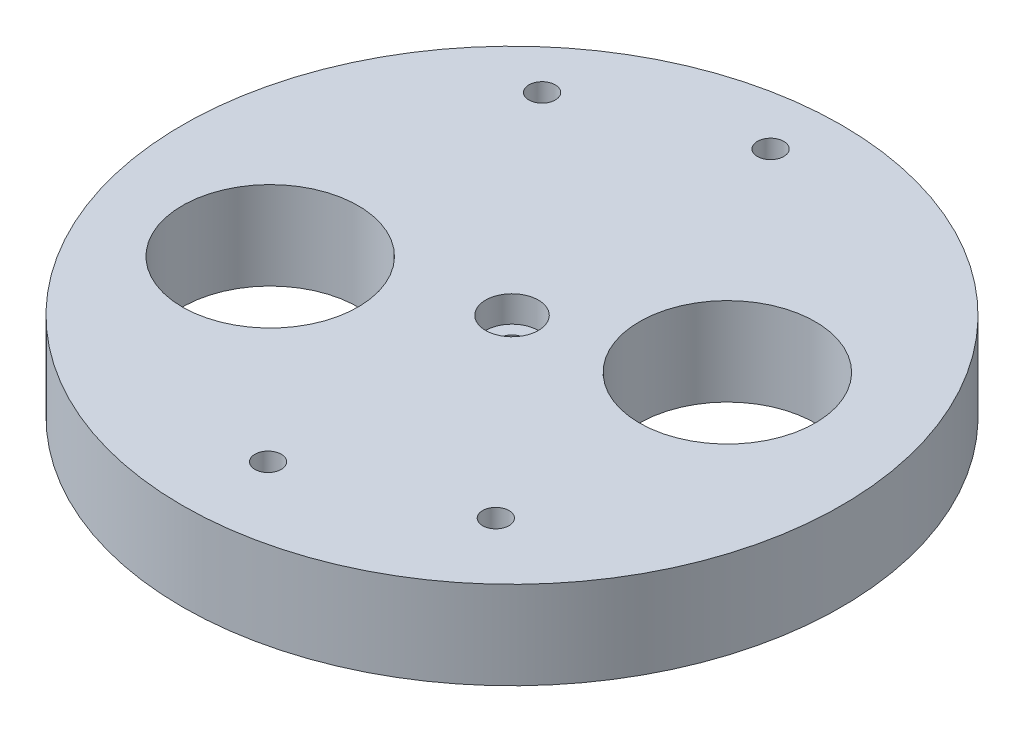
ISO-10303-21;
HEADER;
FILE_DESCRIPTION(('STEP AP214'),'2;1');
FILE_NAME('part.step','',(''),(''),'','','');
FILE_SCHEMA(('AUTOMOTIVE_DESIGN { 1 0 10303 214 1 1 1 1 }'));
ENDSEC;
DATA;
#1=APPLICATION_CONTEXT('core data for automotive mechanical design processes');
#2=APPLICATION_PROTOCOL_DEFINITION('international standard','automotive_design',2000,#1);
#3=PRODUCT_CONTEXT('',#1,'mechanical');
#4=PRODUCT('Part','Part','',(#3));
#5=PRODUCT_RELATED_PRODUCT_CATEGORY('part','',(#4));
#6=PRODUCT_DEFINITION_FORMATION('','',#4);
#7=PRODUCT_DEFINITION_CONTEXT('part definition',#1,'design');
#8=PRODUCT_DEFINITION('design','',#6,#7);
#9=PRODUCT_DEFINITION_SHAPE('','',#8);
#10=(LENGTH_UNIT() NAMED_UNIT(*) SI_UNIT(.MILLI.,.METRE.));
#11=(NAMED_UNIT(*) PLANE_ANGLE_UNIT() SI_UNIT($,.RADIAN.));
#12=(NAMED_UNIT(*) SI_UNIT($,.STERADIAN.) SOLID_ANGLE_UNIT());
#13=UNCERTAINTY_MEASURE_WITH_UNIT(LENGTH_MEASURE(1.E-05),#10,'distance_accuracy_value','');
#14=(GEOMETRIC_REPRESENTATION_CONTEXT(3) GLOBAL_UNCERTAINTY_ASSIGNED_CONTEXT((#13)) GLOBAL_UNIT_ASSIGNED_CONTEXT((#10,
#11,#12)) REPRESENTATION_CONTEXT('',''));
#15=CARTESIAN_POINT('',(0.,0.,0.));
#16=DIRECTION('',(0.,0.,1.));
#17=DIRECTION('',(1.,0.,0.));
#18=AXIS2_PLACEMENT_3D('',#15,#16,#17);
#19=CARTESIAN_POINT('',(0.,0.,0.));
#20=DIRECTION('',(0.,1.,0.));
#21=DIRECTION('',(0.,0.,1.));
#22=AXIS2_PLACEMENT_3D('',#19,#20,#21);
#23=CYLINDRICAL_SURFACE('',#22,1.5);
#24=CARTESIAN_POINT('',(0.,5.,0.));
#25=DIRECTION('',(0.,-1.,0.));
#26=DIRECTION('',(0.,0.,-1.));
#27=AXIS2_PLACEMENT_3D('',#24,#25,#26);
#28=CIRCLE('',#27,1.5);
#29=CARTESIAN_POINT('',(0.,5.,-1.5));
#30=VERTEX_POINT('',#29);
#31=EDGE_CURVE('E63',#30,#30,#28,.F.);
#32=ORIENTED_EDGE('',*,*,#31,.F.);
#33=EDGE_LOOP('',(#32));
#34=FACE_BOUND('',#33,.T.);
#35=CARTESIAN_POINT('',(0.,7.,0.));
#36=DIRECTION('',(0.,1.,0.));
#37=DIRECTION('',(0.,0.,1.));
#38=AXIS2_PLACEMENT_3D('',#35,#36,#37);
#39=CIRCLE('',#38,1.5);
#40=CARTESIAN_POINT('',(0.,7.,1.5));
#41=VERTEX_POINT('',#40);
#42=EDGE_CURVE('E52',#41,#41,#39,.F.);
#43=ORIENTED_EDGE('',*,*,#42,.F.);
#44=EDGE_LOOP('',(#43));
#45=FACE_BOUND('',#44,.T.);
#46=ADVANCED_FACE('F48',(#34,#45),#23,.F.);
#47=CARTESIAN_POINT('',(-1.67951488448822,0.,-31.1035243943959));
#48=DIRECTION('',(0.,1.,0.));
#49=DIRECTION('',(0.,0.,1.));
#50=AXIS2_PLACEMENT_3D('',#47,#48,#49);
#51=CYLINDRICAL_SURFACE('',#50,1.5);
#52=CARTESIAN_POINT('',(-1.67951488448822,10.,-31.1035243943959));
#53=DIRECTION('',(0.,1.,0.));
#54=DIRECTION('',(0.,0.,1.));
#55=AXIS2_PLACEMENT_3D('',#52,#53,#54);
#56=CIRCLE('',#55,1.5);
#57=CARTESIAN_POINT('',(-1.67951488448822,10.,-29.6035243943959));
#58=VERTEX_POINT('',#57);
#59=EDGE_CURVE('E88',#58,#58,#56,.T.);
#60=ORIENTED_EDGE('',*,*,#59,.T.);
#61=EDGE_LOOP('',(#60));
#62=FACE_BOUND('',#61,.T.);
#63=CARTESIAN_POINT('',(-1.67951488448822,5.,-31.1035243943959));
#64=DIRECTION('',(0.,-1.,0.));
#65=DIRECTION('',(0.,0.,-1.));
#66=AXIS2_PLACEMENT_3D('',#63,#64,#65);
#67=CIRCLE('',#66,1.5);
#68=CARTESIAN_POINT('',(-1.67951488448822,5.,-32.6035243943959));
#69=VERTEX_POINT('',#68);
#70=EDGE_CURVE('E85',#69,#69,#67,.F.);
#71=ORIENTED_EDGE('',*,*,#70,.F.);
#72=EDGE_LOOP('',(#71));
#73=FACE_BOUND('',#72,.T.);
#74=ADVANCED_FACE('F203',(#62,#73),#51,.F.);
#75=CARTESIAN_POINT('',(19.0705347131299,0.,20.9103184614083));
#76=DIRECTION('',(0.,1.,0.));
#77=DIRECTION('',(0.,0.,1.));
#78=AXIS2_PLACEMENT_3D('',#75,#76,#77);
#79=CYLINDRICAL_SURFACE('',#78,1.5);
#80=CARTESIAN_POINT('',(19.0705347131299,10.,20.9103184614083));
#81=DIRECTION('',(0.,1.,0.));
#82=DIRECTION('',(0.,0.,1.));
#83=AXIS2_PLACEMENT_3D('',#80,#81,#82);
#84=CIRCLE('',#83,1.5);
#85=CARTESIAN_POINT('',(19.0705347131299,10.,22.4103184614083));
#86=VERTEX_POINT('',#85);
#87=EDGE_CURVE('E93',#86,#86,#84,.T.);
#88=ORIENTED_EDGE('',*,*,#87,.T.);
#89=EDGE_LOOP('',(#88));
#90=FACE_BOUND('',#89,.T.);
#91=CARTESIAN_POINT('',(19.0705347131299,5.,20.9103184614083));
#92=DIRECTION('',(0.,-1.,0.));
#93=DIRECTION('',(0.,0.,-1.));
#94=AXIS2_PLACEMENT_3D('',#91,#92,#93);
#95=CIRCLE('',#94,1.5);
#96=CARTESIAN_POINT('',(19.0705347131299,5.,19.4103184614083));
#97=VERTEX_POINT('',#96);
#98=EDGE_CURVE('E82',#97,#97,#95,.F.);
#99=ORIENTED_EDGE('',*,*,#98,.F.);
#100=EDGE_LOOP('',(#99));
#101=FACE_BOUND('',#100,.T.);
#102=ADVANCED_FACE('F199',(#90,#101),#79,.F.);
#103=CARTESIAN_POINT('',(0.56460347082257,0.,28.3183901894288));
#104=DIRECTION('',(0.,1.,0.));
#105=DIRECTION('',(0.,0.,1.));
#106=AXIS2_PLACEMENT_3D('',#103,#104,#105);
#107=CYLINDRICAL_SURFACE('',#106,1.5);
#108=CARTESIAN_POINT('',(0.56460347082257,10.,28.3183901894288));
#109=DIRECTION('',(0.,1.,0.));
#110=DIRECTION('',(0.,0.,1.));
#111=AXIS2_PLACEMENT_3D('',#108,#109,#110);
#112=CIRCLE('',#111,1.5);
#113=CARTESIAN_POINT('',(0.56460347082257,10.,29.8183901894288));
#114=VERTEX_POINT('',#113);
#115=EDGE_CURVE('E99',#114,#114,#112,.T.);
#116=ORIENTED_EDGE('',*,*,#115,.T.);
#117=EDGE_LOOP('',(#116));
#118=FACE_BOUND('',#117,.T.);
#119=CARTESIAN_POINT('',(0.56460347082257,5.,28.3183901894288));
#120=DIRECTION('',(0.,-1.,0.));
#121=DIRECTION('',(0.,0.,-1.));
#122=AXIS2_PLACEMENT_3D('',#119,#120,#121);
#123=CIRCLE('',#122,1.5);
#124=CARTESIAN_POINT('',(0.56460347082257,5.,26.8183901894288));
#125=VERTEX_POINT('',#124);
#126=EDGE_CURVE('E77',#125,#125,#123,.F.);
#127=ORIENTED_EDGE('',*,*,#126,.F.);
#128=EDGE_LOOP('',(#127));
#129=FACE_BOUND('',#128,.T.);
#130=ADVANCED_FACE('F202',(#118,#129),#107,.F.);
#131=CARTESIAN_POINT('',(-20.247076250936,0.,-23.670781636625));
#132=DIRECTION('',(0.,1.,0.));
#133=DIRECTION('',(0.,0.,1.));
#134=AXIS2_PLACEMENT_3D('',#131,#132,#133);
#135=CYLINDRICAL_SURFACE('',#134,1.5);
#136=CARTESIAN_POINT('',(-20.247076250936,10.,-23.670781636625));
#137=DIRECTION('',(0.,1.,0.));
#138=DIRECTION('',(0.,0.,1.));
#139=AXIS2_PLACEMENT_3D('',#136,#137,#138);
#140=CIRCLE('',#139,1.5);
#141=CARTESIAN_POINT('',(-20.247076250936,10.,-22.170781636625));
#142=VERTEX_POINT('',#141);
#143=EDGE_CURVE('E108',#142,#142,#140,.T.);
#144=ORIENTED_EDGE('',*,*,#143,.T.);
#145=EDGE_LOOP('',(#144));
#146=FACE_BOUND('',#145,.T.);
#147=CARTESIAN_POINT('',(-20.247076250936,5.,-23.670781636625));
#148=DIRECTION('',(0.,-1.,0.));
#149=DIRECTION('',(0.,0.,-1.));
#150=AXIS2_PLACEMENT_3D('',#147,#148,#149);
#151=CIRCLE('',#150,1.5);
#152=CARTESIAN_POINT('',(-20.247076250936,5.,-25.170781636625));
#153=VERTEX_POINT('',#152);
#154=EDGE_CURVE('E73',#153,#153,#151,.F.);
#155=ORIENTED_EDGE('',*,*,#154,.F.);
#156=EDGE_LOOP('',(#155));
#157=FACE_BOUND('',#156,.T.);
#158=ADVANCED_FACE('F251',(#146,#157),#135,.F.);
#159=CARTESIAN_POINT('',(0.,10.,0.));
#160=DIRECTION('',(0.,-1.,0.));
#161=DIRECTION('',(0.,0.,-1.));
#162=AXIS2_PLACEMENT_3D('',#159,#160,#161);
#163=CYLINDRICAL_SURFACE('',#162,37.5);
#164=CARTESIAN_POINT('',(0.,10.,0.));
#165=DIRECTION('',(0.,1.,0.));
#166=DIRECTION('',(0.,0.,1.));
#167=AXIS2_PLACEMENT_3D('',#164,#165,#166);
#168=CIRCLE('',#167,37.5);
#169=CARTESIAN_POINT('',(0.,10.,37.5));
#170=VERTEX_POINT('',#169);
#171=EDGE_CURVE('E11',#170,#170,#168,.T.);
#172=ORIENTED_EDGE('',*,*,#171,.F.);
#173=EDGE_LOOP('',(#172));
#174=FACE_BOUND('',#173,.T.);
#175=CARTESIAN_POINT('',(0.,0.,0.));
#176=DIRECTION('',(0.,1.,0.));
#177=DIRECTION('',(0.,0.,1.));
#178=AXIS2_PLACEMENT_3D('',#175,#176,#177);
#179=CIRCLE('',#178,37.5);
#180=CARTESIAN_POINT('',(0.,0.,37.5));
#181=VERTEX_POINT('',#180);
#182=EDGE_CURVE('E57',#181,#181,#179,.T.);
#183=ORIENTED_EDGE('',*,*,#182,.T.);
#184=EDGE_LOOP('',(#183));
#185=FACE_BOUND('',#184,.T.);
#186=ADVANCED_FACE('F50',(#174,#185),#163,.T.);
#187=CARTESIAN_POINT('',(0.,10.,0.));
#188=DIRECTION('',(0.,1.,0.));
#189=DIRECTION('',(0.,0.,1.));
#190=AXIS2_PLACEMENT_3D('',#187,#188,#189);
#191=PLANE('',#190);
#192=CARTESIAN_POINT('',(17.8764483364233,10.,-6.62927892182807));
#193=DIRECTION('',(0.,1.,0.));
#194=DIRECTION('',(0.,0.,1.));
#195=AXIS2_PLACEMENT_3D('',#192,#193,#194);
#196=CIRCLE('',#195,10.);
#197=CARTESIAN_POINT('',(17.8764483364233,10.,3.37072107817193));
#198=VERTEX_POINT('',#197);
#199=EDGE_CURVE('E167',#198,#198,#196,.T.);
#200=ORIENTED_EDGE('',*,*,#199,.F.);
#201=EDGE_LOOP('',(#200));
#202=FACE_BOUND('',#201,.T.);
#203=CARTESIAN_POINT('',(-19.5657004740326,10.,7.94754173046286));
#204=DIRECTION('',(0.,1.,0.));
#205=DIRECTION('',(0.,0.,1.));
#206=AXIS2_PLACEMENT_3D('',#203,#204,#205);
#207=CIRCLE('',#206,10.);
#208=CARTESIAN_POINT('',(-19.5657004740326,10.,17.9475417304629));
#209=VERTEX_POINT('',#208);
#210=EDGE_CURVE('E159',#209,#209,#207,.T.);
#211=ORIENTED_EDGE('',*,*,#210,.F.);
#212=EDGE_LOOP('',(#211));
#213=FACE_BOUND('',#212,.T.);
#214=CARTESIAN_POINT('',(0.,10.,0.));
#215=DIRECTION('',(0.,1.,0.));
#216=DIRECTION('',(0.,0.,1.));
#217=AXIS2_PLACEMENT_3D('',#214,#215,#216);
#218=CIRCLE('',#217,3.);
#219=CARTESIAN_POINT('',(0.,10.,3.));
#220=VERTEX_POINT('',#219);
#221=EDGE_CURVE('E150',#220,#220,#218,.T.);
#222=ORIENTED_EDGE('',*,*,#221,.F.);
#223=EDGE_LOOP('',(#222));
#224=FACE_BOUND('',#223,.T.);
#225=ORIENTED_EDGE('',*,*,#143,.F.);
#226=EDGE_LOOP('',(#225));
#227=FACE_BOUND('',#226,.T.);
#228=ORIENTED_EDGE('',*,*,#115,.F.);
#229=EDGE_LOOP('',(#228));
#230=FACE_BOUND('',#229,.T.);
#231=ORIENTED_EDGE('',*,*,#87,.F.);
#232=EDGE_LOOP('',(#231));
#233=FACE_BOUND('',#232,.T.);
#234=ORIENTED_EDGE('',*,*,#59,.F.);
#235=EDGE_LOOP('',(#234));
#236=FACE_BOUND('',#235,.T.);
#237=ORIENTED_EDGE('',*,*,#171,.T.);
#238=EDGE_LOOP('',(#237));
#239=FACE_BOUND('',#238,.T.);
#240=ADVANCED_FACE('F185',(#202,#213,#224,#227,#230,#233,#236,#239),#191,.T.);
#241=CARTESIAN_POINT('',(0.,0.,0.));
#242=DIRECTION('',(0.,1.,0.));
#243=DIRECTION('',(0.,0.,1.));
#244=AXIS2_PLACEMENT_3D('',#241,#242,#243);
#245=PLANE('',#244);
#246=CARTESIAN_POINT('',(17.8764483364233,0.,-6.62927892182807));
#247=DIRECTION('',(0.,1.,0.));
#248=DIRECTION('',(0.,0.,1.));
#249=AXIS2_PLACEMENT_3D('',#246,#247,#248);
#250=CIRCLE('',#249,10.);
#251=CARTESIAN_POINT('',(17.8764483364233,0.,3.37072107817193));
#252=VERTEX_POINT('',#251);
#253=EDGE_CURVE('E155',#252,#252,#250,.T.);
#254=ORIENTED_EDGE('',*,*,#253,.T.);
#255=EDGE_LOOP('',(#254));
#256=FACE_BOUND('',#255,.T.);
#257=CARTESIAN_POINT('',(-19.5657004740326,0.,7.94754173046286));
#258=DIRECTION('',(0.,1.,0.));
#259=DIRECTION('',(0.,0.,1.));
#260=AXIS2_PLACEMENT_3D('',#257,#258,#259);
#261=CIRCLE('',#260,10.);
#262=CARTESIAN_POINT('',(-19.5657004740326,0.,17.9475417304629));
#263=VERTEX_POINT('',#262);
#264=EDGE_CURVE('E163',#263,#263,#261,.T.);
#265=ORIENTED_EDGE('',*,*,#264,.T.);
#266=EDGE_LOOP('',(#265));
#267=FACE_BOUND('',#266,.T.);
#268=CARTESIAN_POINT('',(19.0705347131299,0.,20.9103184614083));
#269=DIRECTION('',(0.,-1.,0.));
#270=DIRECTION('',(0.,0.,-1.));
#271=AXIS2_PLACEMENT_3D('',#268,#269,#270);
#272=CIRCLE('',#271,3.);
#273=CARTESIAN_POINT('',(19.0705347131299,0.,17.9103184614083));
#274=VERTEX_POINT('',#273);
#275=EDGE_CURVE('E143',#274,#274,#272,.T.);
#276=ORIENTED_EDGE('',*,*,#275,.F.);
#277=EDGE_LOOP('',(#276));
#278=FACE_BOUND('',#277,.T.);
#279=CARTESIAN_POINT('',(0.56460347082257,0.,28.3183901894288));
#280=DIRECTION('',(0.,-1.,0.));
#281=DIRECTION('',(0.,0.,-1.));
#282=AXIS2_PLACEMENT_3D('',#279,#280,#281);
#283=CIRCLE('',#282,3.);
#284=CARTESIAN_POINT('',(0.56460347082257,0.,25.3183901894288));
#285=VERTEX_POINT('',#284);
#286=EDGE_CURVE('E135',#285,#285,#283,.T.);
#287=ORIENTED_EDGE('',*,*,#286,.F.);
#288=EDGE_LOOP('',(#287));
#289=FACE_BOUND('',#288,.T.);
#290=CARTESIAN_POINT('',(-1.67951488448822,0.,-31.1035243943959));
#291=DIRECTION('',(0.,-1.,0.));
#292=DIRECTION('',(0.,0.,-1.));
#293=AXIS2_PLACEMENT_3D('',#290,#291,#292);
#294=CIRCLE('',#293,3.);
#295=CARTESIAN_POINT('',(-1.67951488448822,0.,-34.1035243943959));
#296=VERTEX_POINT('',#295);
#297=EDGE_CURVE('E127',#296,#296,#294,.T.);
#298=ORIENTED_EDGE('',*,*,#297,.F.);
#299=EDGE_LOOP('',(#298));
#300=FACE_BOUND('',#299,.T.);
#301=CARTESIAN_POINT('',(-20.247076250936,0.,-23.670781636625));
#302=DIRECTION('',(0.,-1.,0.));
#303=DIRECTION('',(0.,0.,-1.));
#304=AXIS2_PLACEMENT_3D('',#301,#302,#303);
#305=CIRCLE('',#304,3.);
#306=CARTESIAN_POINT('',(-20.247076250936,0.,-26.670781636625));
#307=VERTEX_POINT('',#306);
#308=EDGE_CURVE('E119',#307,#307,#305,.T.);
#309=ORIENTED_EDGE('',*,*,#308,.F.);
#310=EDGE_LOOP('',(#309));
#311=FACE_BOUND('',#310,.T.);
#312=CARTESIAN_POINT('',(0.,0.,0.));
#313=DIRECTION('',(0.,-1.,0.));
#314=DIRECTION('',(0.,0.,-1.));
#315=AXIS2_PLACEMENT_3D('',#312,#313,#314);
#316=CIRCLE('',#315,5.);
#317=CARTESIAN_POINT('',(0.,0.,-5.));
#318=VERTEX_POINT('',#317);
#319=EDGE_CURVE('E66',#318,#318,#316,.T.);
#320=ORIENTED_EDGE('',*,*,#319,.F.);
#321=EDGE_LOOP('',(#320));
#322=FACE_BOUND('',#321,.T.);
#323=ORIENTED_EDGE('',*,*,#182,.F.);
#324=EDGE_LOOP('',(#323));
#325=FACE_BOUND('',#324,.T.);
#326=ADVANCED_FACE('F175',(#256,#267,#278,#289,#300,#311,#322,#325),#245,.F.);
#327=CARTESIAN_POINT('',(0.,5.,0.));
#328=DIRECTION('',(0.,-1.,0.));
#329=DIRECTION('',(0.,0.,-1.));
#330=AXIS2_PLACEMENT_3D('',#327,#328,#329);
#331=PLANE('',#330);
#332=CARTESIAN_POINT('',(0.,5.,0.));
#333=DIRECTION('',(0.,-1.,0.));
#334=DIRECTION('',(0.,0.,-1.));
#335=AXIS2_PLACEMENT_3D('',#332,#333,#334);
#336=CIRCLE('',#335,5.);
#337=CARTESIAN_POINT('',(0.,5.,-5.));
#338=VERTEX_POINT('',#337);
#339=EDGE_CURVE('E72',#338,#338,#336,.T.);
#340=ORIENTED_EDGE('',*,*,#339,.T.);
#341=EDGE_LOOP('',(#340));
#342=FACE_BOUND('',#341,.T.);
#343=ORIENTED_EDGE('',*,*,#31,.T.);
#344=EDGE_LOOP('',(#343));
#345=FACE_BOUND('',#344,.T.);
#346=ADVANCED_FACE('F237',(#342,#345),#331,.T.);
#347=CARTESIAN_POINT('',(0.,5.,0.));
#348=DIRECTION('',(0.,-1.,0.));
#349=DIRECTION('',(0.,0.,-1.));
#350=AXIS2_PLACEMENT_3D('',#347,#348,#349);
#351=CYLINDRICAL_SURFACE('',#350,5.);
#352=ORIENTED_EDGE('',*,*,#339,.F.);
#353=EDGE_LOOP('',(#352));
#354=FACE_BOUND('',#353,.T.);
#355=ORIENTED_EDGE('',*,*,#319,.T.);
#356=EDGE_LOOP('',(#355));
#357=FACE_BOUND('',#356,.T.);
#358=ADVANCED_FACE('F234',(#354,#357),#351,.F.);
#359=CARTESIAN_POINT('',(-20.247076250936,5.,-23.670781636625));
#360=DIRECTION('',(0.,-1.,0.));
#361=DIRECTION('',(0.,0.,-1.));
#362=AXIS2_PLACEMENT_3D('',#359,#360,#361);
#363=PLANE('',#362);
#364=CARTESIAN_POINT('',(-20.247076250936,5.,-23.670781636625));
#365=DIRECTION('',(0.,-1.,0.));
#366=DIRECTION('',(0.,0.,-1.));
#367=AXIS2_PLACEMENT_3D('',#364,#365,#366);
#368=CIRCLE('',#367,3.);
#369=CARTESIAN_POINT('',(-20.247076250936,5.,-26.670781636625));
#370=VERTEX_POINT('',#369);
#371=EDGE_CURVE('E123',#370,#370,#368,.T.);
#372=ORIENTED_EDGE('',*,*,#371,.T.);
#373=EDGE_LOOP('',(#372));
#374=FACE_BOUND('',#373,.T.);
#375=ORIENTED_EDGE('',*,*,#154,.T.);
#376=EDGE_LOOP('',(#375));
#377=FACE_BOUND('',#376,.T.);
#378=ADVANCED_FACE('F245',(#374,#377),#363,.T.);
#379=CARTESIAN_POINT('',(-20.247076250936,5.,-23.670781636625));
#380=DIRECTION('',(0.,-1.,0.));
#381=DIRECTION('',(0.,0.,-1.));
#382=AXIS2_PLACEMENT_3D('',#379,#380,#381);
#383=CYLINDRICAL_SURFACE('',#382,3.);
#384=ORIENTED_EDGE('',*,*,#371,.F.);
#385=EDGE_LOOP('',(#384));
#386=FACE_BOUND('',#385,.T.);
#387=ORIENTED_EDGE('',*,*,#308,.T.);
#388=EDGE_LOOP('',(#387));
#389=FACE_BOUND('',#388,.T.);
#390=ADVANCED_FACE('F255',(#386,#389),#383,.F.);
#391=CARTESIAN_POINT('',(0.56460347082257,5.,28.3183901894288));
#392=DIRECTION('',(0.,-1.,0.));
#393=DIRECTION('',(0.,0.,-1.));
#394=AXIS2_PLACEMENT_3D('',#391,#392,#393);
#395=PLANE('',#394);
#396=CARTESIAN_POINT('',(0.56460347082257,5.,28.3183901894288));
#397=DIRECTION('',(0.,-1.,0.));
#398=DIRECTION('',(0.,0.,-1.));
#399=AXIS2_PLACEMENT_3D('',#396,#397,#398);
#400=CIRCLE('',#399,3.);
#401=CARTESIAN_POINT('',(0.56460347082257,5.,25.3183901894288));
#402=VERTEX_POINT('',#401);
#403=EDGE_CURVE('E139',#402,#402,#400,.T.);
#404=ORIENTED_EDGE('',*,*,#403,.T.);
#405=EDGE_LOOP('',(#404));
#406=FACE_BOUND('',#405,.T.);
#407=ORIENTED_EDGE('',*,*,#126,.T.);
#408=EDGE_LOOP('',(#407));
#409=FACE_BOUND('',#408,.T.);
#410=ADVANCED_FACE('F220',(#406,#409),#395,.T.);
#411=CARTESIAN_POINT('',(0.56460347082257,5.,28.3183901894288));
#412=DIRECTION('',(0.,-1.,0.));
#413=DIRECTION('',(0.,0.,-1.));
#414=AXIS2_PLACEMENT_3D('',#411,#412,#413);
#415=CYLINDRICAL_SURFACE('',#414,3.);
#416=ORIENTED_EDGE('',*,*,#403,.F.);
#417=EDGE_LOOP('',(#416));
#418=FACE_BOUND('',#417,.T.);
#419=ORIENTED_EDGE('',*,*,#286,.T.);
#420=EDGE_LOOP('',(#419));
#421=FACE_BOUND('',#420,.T.);
#422=ADVANCED_FACE('F210',(#418,#421),#415,.F.);
#423=CARTESIAN_POINT('',(19.0705347131299,5.,20.9103184614083));
#424=DIRECTION('',(0.,-1.,0.));
#425=DIRECTION('',(0.,0.,-1.));
#426=AXIS2_PLACEMENT_3D('',#423,#424,#425);
#427=PLANE('',#426);
#428=CARTESIAN_POINT('',(19.0705347131299,5.,20.9103184614083));
#429=DIRECTION('',(0.,-1.,0.));
#430=DIRECTION('',(0.,0.,-1.));
#431=AXIS2_PLACEMENT_3D('',#428,#429,#430);
#432=CIRCLE('',#431,3.);
#433=CARTESIAN_POINT('',(19.0705347131299,5.,17.9103184614083));
#434=VERTEX_POINT('',#433);
#435=EDGE_CURVE('E78',#434,#434,#432,.T.);
#436=ORIENTED_EDGE('',*,*,#435,.T.);
#437=EDGE_LOOP('',(#436));
#438=FACE_BOUND('',#437,.T.);
#439=ORIENTED_EDGE('',*,*,#98,.T.);
#440=EDGE_LOOP('',(#439));
#441=FACE_BOUND('',#440,.T.);
#442=ADVANCED_FACE('F207',(#438,#441),#427,.T.);
#443=CARTESIAN_POINT('',(19.0705347131299,5.,20.9103184614083));
#444=DIRECTION('',(0.,-1.,0.));
#445=DIRECTION('',(0.,0.,-1.));
#446=AXIS2_PLACEMENT_3D('',#443,#444,#445);
#447=CYLINDRICAL_SURFACE('',#446,3.);
#448=ORIENTED_EDGE('',*,*,#435,.F.);
#449=EDGE_LOOP('',(#448));
#450=FACE_BOUND('',#449,.T.);
#451=ORIENTED_EDGE('',*,*,#275,.T.);
#452=EDGE_LOOP('',(#451));
#453=FACE_BOUND('',#452,.T.);
#454=ADVANCED_FACE('F209',(#450,#453),#447,.F.);
#455=CARTESIAN_POINT('',(-1.67951488448822,5.,-31.1035243943959));
#456=DIRECTION('',(0.,-1.,0.));
#457=DIRECTION('',(0.,0.,-1.));
#458=AXIS2_PLACEMENT_3D('',#455,#456,#457);
#459=PLANE('',#458);
#460=CARTESIAN_POINT('',(-1.67951488448822,5.,-31.1035243943959));
#461=DIRECTION('',(0.,-1.,0.));
#462=DIRECTION('',(0.,0.,-1.));
#463=AXIS2_PLACEMENT_3D('',#460,#461,#462);
#464=CIRCLE('',#463,3.);
#465=CARTESIAN_POINT('',(-1.67951488448822,5.,-34.1035243943959));
#466=VERTEX_POINT('',#465);
#467=EDGE_CURVE('E131',#466,#466,#464,.T.);
#468=ORIENTED_EDGE('',*,*,#467,.T.);
#469=EDGE_LOOP('',(#468));
#470=FACE_BOUND('',#469,.T.);
#471=ORIENTED_EDGE('',*,*,#70,.T.);
#472=EDGE_LOOP('',(#471));
#473=FACE_BOUND('',#472,.T.);
#474=ADVANCED_FACE('F217',(#470,#473),#459,.T.);
#475=CARTESIAN_POINT('',(-1.67951488448822,5.,-31.1035243943959));
#476=DIRECTION('',(0.,-1.,0.));
#477=DIRECTION('',(0.,0.,-1.));
#478=AXIS2_PLACEMENT_3D('',#475,#476,#477);
#479=CYLINDRICAL_SURFACE('',#478,3.);
#480=ORIENTED_EDGE('',*,*,#467,.F.);
#481=EDGE_LOOP('',(#480));
#482=FACE_BOUND('',#481,.T.);
#483=ORIENTED_EDGE('',*,*,#297,.T.);
#484=EDGE_LOOP('',(#483));
#485=FACE_BOUND('',#484,.T.);
#486=ADVANCED_FACE('F262',(#482,#485),#479,.F.);
#487=CARTESIAN_POINT('',(0.,7.,0.));
#488=DIRECTION('',(0.,1.,0.));
#489=DIRECTION('',(0.,0.,1.));
#490=AXIS2_PLACEMENT_3D('',#487,#488,#489);
#491=PLANE('',#490);
#492=CARTESIAN_POINT('',(0.,7.,0.));
#493=DIRECTION('',(0.,1.,0.));
#494=DIRECTION('',(0.,0.,1.));
#495=AXIS2_PLACEMENT_3D('',#492,#493,#494);
#496=CIRCLE('',#495,3.);
#497=CARTESIAN_POINT('',(0.,7.,3.));
#498=VERTEX_POINT('',#497);
#499=EDGE_CURVE('E154',#498,#498,#496,.T.);
#500=ORIENTED_EDGE('',*,*,#499,.T.);
#501=EDGE_LOOP('',(#500));
#502=FACE_BOUND('',#501,.T.);
#503=ORIENTED_EDGE('',*,*,#42,.T.);
#504=EDGE_LOOP('',(#503));
#505=FACE_BOUND('',#504,.T.);
#506=ADVANCED_FACE('F265',(#502,#505),#491,.T.);
#507=CARTESIAN_POINT('',(0.,7.,0.));
#508=DIRECTION('',(0.,1.,0.));
#509=DIRECTION('',(0.,0.,1.));
#510=AXIS2_PLACEMENT_3D('',#507,#508,#509);
#511=CYLINDRICAL_SURFACE('',#510,3.);
#512=ORIENTED_EDGE('',*,*,#499,.F.);
#513=EDGE_LOOP('',(#512));
#514=FACE_BOUND('',#513,.T.);
#515=ORIENTED_EDGE('',*,*,#221,.T.);
#516=EDGE_LOOP('',(#515));
#517=FACE_BOUND('',#516,.T.);
#518=ADVANCED_FACE('F387',(#514,#517),#511,.F.);
#519=CARTESIAN_POINT('',(-19.5657004740326,0.,7.94754173046286));
#520=DIRECTION('',(0.,1.,0.));
#521=DIRECTION('',(0.,0.,1.));
#522=AXIS2_PLACEMENT_3D('',#519,#520,#521);
#523=CYLINDRICAL_SURFACE('',#522,10.);
#524=ORIENTED_EDGE('',*,*,#264,.F.);
#525=EDGE_LOOP('',(#524));
#526=FACE_BOUND('',#525,.T.);
#527=ORIENTED_EDGE('',*,*,#210,.T.);
#528=EDGE_LOOP('',(#527));
#529=FACE_BOUND('',#528,.T.);
#530=ADVANCED_FACE('F181',(#526,#529),#523,.F.);
#531=CARTESIAN_POINT('',(17.8764483364233,0.,-6.62927892182807));
#532=DIRECTION('',(0.,1.,0.));
#533=DIRECTION('',(0.,0.,1.));
#534=AXIS2_PLACEMENT_3D('',#531,#532,#533);
#535=CYLINDRICAL_SURFACE('',#534,10.);
#536=ORIENTED_EDGE('',*,*,#253,.F.);
#537=EDGE_LOOP('',(#536));
#538=FACE_BOUND('',#537,.T.);
#539=ORIENTED_EDGE('',*,*,#199,.T.);
#540=EDGE_LOOP('',(#539));
#541=FACE_BOUND('',#540,.T.);
#542=ADVANCED_FACE('F178',(#538,#541),#535,.F.);
#543=CLOSED_SHELL('',(#46,#74,#102,#130,#158,#186,#240,#326,#346,#358,#378,#390,#410,#422,#442,
#454,#474,#486,#506,#518,#530,#542));
#544=MANIFOLD_SOLID_BREP('B2',#543);
#545=ADVANCED_BREP_SHAPE_REPRESENTATION('',(#18,#544),#14);
#546=SHAPE_DEFINITION_REPRESENTATION(#9,#545);
ENDSEC;
END-ISO-10303-21;
